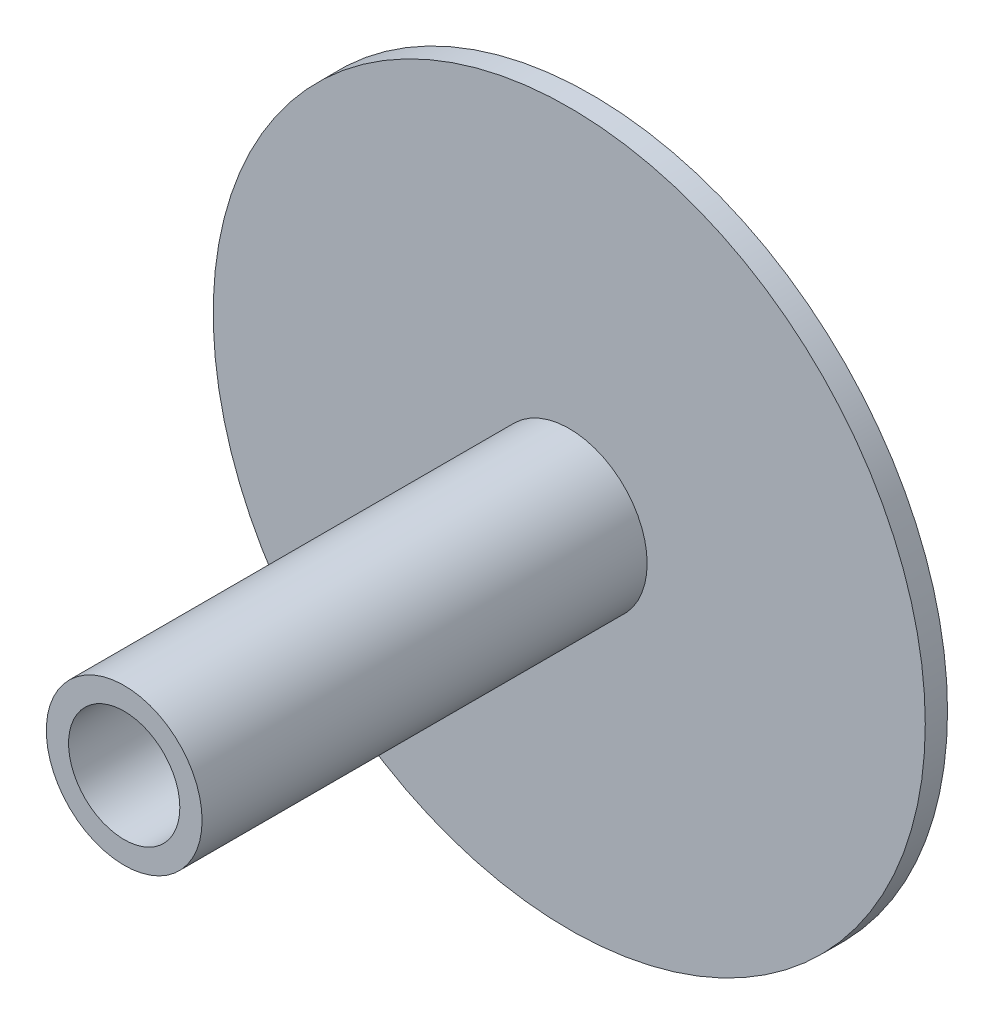
ISO-10303-21;
HEADER;
FILE_DESCRIPTION(('STEP AP214'),'2;1');
FILE_NAME('part.step','',(''),(''),'','','');
FILE_SCHEMA(('AUTOMOTIVE_DESIGN { 1 0 10303 214 1 1 1 1 }'));
ENDSEC;
DATA;
#1=APPLICATION_CONTEXT('core data for automotive mechanical design processes');
#2=APPLICATION_PROTOCOL_DEFINITION('international standard','automotive_design',2000,#1);
#3=PRODUCT_CONTEXT('',#1,'mechanical');
#4=PRODUCT('Part','Part','',(#3));
#5=PRODUCT_RELATED_PRODUCT_CATEGORY('part','',(#4));
#6=PRODUCT_DEFINITION_FORMATION('','',#4);
#7=PRODUCT_DEFINITION_CONTEXT('part definition',#1,'design');
#8=PRODUCT_DEFINITION('design','',#6,#7);
#9=PRODUCT_DEFINITION_SHAPE('','',#8);
#10=(LENGTH_UNIT() NAMED_UNIT(*) SI_UNIT(.MILLI.,.METRE.));
#11=(NAMED_UNIT(*) PLANE_ANGLE_UNIT() SI_UNIT($,.RADIAN.));
#12=(NAMED_UNIT(*) SI_UNIT($,.STERADIAN.) SOLID_ANGLE_UNIT());
#13=UNCERTAINTY_MEASURE_WITH_UNIT(LENGTH_MEASURE(1.E-05),#10,'distance_accuracy_value','');
#14=(GEOMETRIC_REPRESENTATION_CONTEXT(3) GLOBAL_UNCERTAINTY_ASSIGNED_CONTEXT((#13)) GLOBAL_UNIT_ASSIGNED_CONTEXT((#10,
#11,#12)) REPRESENTATION_CONTEXT('',''));
#15=CARTESIAN_POINT('',(0.,0.,0.));
#16=DIRECTION('',(0.,0.,1.));
#17=DIRECTION('',(1.,0.,0.));
#18=AXIS2_PLACEMENT_3D('',#15,#16,#17);
#19=CARTESIAN_POINT('',(0.,0.,1.));
#20=DIRECTION('',(0.,0.,-1.));
#21=DIRECTION('',(-1.,0.,0.));
#22=AXIS2_PLACEMENT_3D('',#19,#20,#21);
#23=CYLINDRICAL_SURFACE('',#22,16.);
#24=CARTESIAN_POINT('',(0.,0.,1.));
#25=DIRECTION('',(0.,0.,1.));
#26=DIRECTION('',(1.,0.,0.));
#27=AXIS2_PLACEMENT_3D('',#24,#25,#26);
#28=CIRCLE('',#27,16.);
#29=CARTESIAN_POINT('',(16.,0.,1.));
#30=VERTEX_POINT('',#29);
#31=EDGE_CURVE('E10',#30,#30,#28,.T.);
#32=ORIENTED_EDGE('',*,*,#31,.F.);
#33=EDGE_LOOP('',(#32));
#34=FACE_BOUND('',#33,.T.);
#35=CARTESIAN_POINT('',(0.,0.,0.));
#36=DIRECTION('',(0.,0.,1.));
#37=DIRECTION('',(1.,0.,0.));
#38=AXIS2_PLACEMENT_3D('',#35,#36,#37);
#39=CIRCLE('',#38,16.);
#40=CARTESIAN_POINT('',(16.,0.,0.));
#41=VERTEX_POINT('',#40);
#42=EDGE_CURVE('E38',#41,#41,#39,.T.);
#43=ORIENTED_EDGE('',*,*,#42,.T.);
#44=EDGE_LOOP('',(#43));
#45=FACE_BOUND('',#44,.T.);
#46=ADVANCED_FACE('F31',(#34,#45),#23,.T.);
#47=CARTESIAN_POINT('',(0.,0.,1.));
#48=DIRECTION('',(0.,0.,1.));
#49=DIRECTION('',(1.,0.,0.));
#50=AXIS2_PLACEMENT_3D('',#47,#48,#49);
#51=PLANE('',#50);
#52=CARTESIAN_POINT('',(0.,0.,1.));
#53=DIRECTION('',(0.,0.,1.));
#54=DIRECTION('',(1.,0.,0.));
#55=AXIS2_PLACEMENT_3D('',#52,#53,#54);
#56=CIRCLE('',#55,3.5);
#57=CARTESIAN_POINT('',(3.5,0.,1.));
#58=VERTEX_POINT('',#57);
#59=EDGE_CURVE('E45',#58,#58,#56,.T.);
#60=ORIENTED_EDGE('',*,*,#59,.F.);
#61=EDGE_LOOP('',(#60));
#62=FACE_BOUND('',#61,.T.);
#63=ORIENTED_EDGE('',*,*,#31,.T.);
#64=EDGE_LOOP('',(#63));
#65=FACE_BOUND('',#64,.T.);
#66=ADVANCED_FACE('F73',(#62,#65),#51,.T.);
#67=CARTESIAN_POINT('',(0.,0.,0.));
#68=DIRECTION('',(0.,0.,1.));
#69=DIRECTION('',(1.,0.,0.));
#70=AXIS2_PLACEMENT_3D('',#67,#68,#69);
#71=PLANE('',#70);
#72=CARTESIAN_POINT('',(0.,0.,0.));
#73=DIRECTION('',(0.,0.,1.));
#74=DIRECTION('',(1.,0.,0.));
#75=AXIS2_PLACEMENT_3D('',#72,#73,#74);
#76=CIRCLE('',#75,2.5);
#77=CARTESIAN_POINT('',(2.5,0.,0.));
#78=VERTEX_POINT('',#77);
#79=EDGE_CURVE('E50',#78,#78,#76,.T.);
#80=ORIENTED_EDGE('',*,*,#79,.T.);
#81=EDGE_LOOP('',(#80));
#82=FACE_BOUND('',#81,.T.);
#83=ORIENTED_EDGE('',*,*,#42,.F.);
#84=EDGE_LOOP('',(#83));
#85=FACE_BOUND('',#84,.T.);
#86=ADVANCED_FACE('F69',(#82,#85),#71,.F.);
#87=CARTESIAN_POINT('',(0.,0.,21.));
#88=DIRECTION('',(0.,0.,-1.));
#89=DIRECTION('',(-1.,0.,0.));
#90=AXIS2_PLACEMENT_3D('',#87,#88,#89);
#91=CYLINDRICAL_SURFACE('',#90,3.5);
#92=CARTESIAN_POINT('',(0.,0.,21.));
#93=DIRECTION('',(0.,0.,1.));
#94=DIRECTION('',(1.,0.,0.));
#95=AXIS2_PLACEMENT_3D('',#92,#93,#94);
#96=CIRCLE('',#95,3.5);
#97=CARTESIAN_POINT('',(3.5,0.,21.));
#98=VERTEX_POINT('',#97);
#99=EDGE_CURVE('E43',#98,#98,#96,.T.);
#100=ORIENTED_EDGE('',*,*,#99,.F.);
#101=EDGE_LOOP('',(#100));
#102=FACE_BOUND('',#101,.T.);
#103=ORIENTED_EDGE('',*,*,#59,.T.);
#104=EDGE_LOOP('',(#103));
#105=FACE_BOUND('',#104,.T.);
#106=ADVANCED_FACE('F63',(#102,#105),#91,.T.);
#107=CARTESIAN_POINT('',(0.,0.,21.));
#108=DIRECTION('',(0.,0.,1.));
#109=DIRECTION('',(1.,0.,0.));
#110=AXIS2_PLACEMENT_3D('',#107,#108,#109);
#111=PLANE('',#110);
#112=CARTESIAN_POINT('',(0.,0.,21.));
#113=DIRECTION('',(0.,0.,1.));
#114=DIRECTION('',(1.,0.,0.));
#115=AXIS2_PLACEMENT_3D('',#112,#113,#114);
#116=CIRCLE('',#115,2.5);
#117=CARTESIAN_POINT('',(2.5,0.,21.));
#118=VERTEX_POINT('',#117);
#119=EDGE_CURVE('E34',#118,#118,#116,.T.);
#120=ORIENTED_EDGE('',*,*,#119,.F.);
#121=EDGE_LOOP('',(#120));
#122=FACE_BOUND('',#121,.T.);
#123=ORIENTED_EDGE('',*,*,#99,.T.);
#124=EDGE_LOOP('',(#123));
#125=FACE_BOUND('',#124,.T.);
#126=ADVANCED_FACE('F60',(#122,#125),#111,.T.);
#127=CARTESIAN_POINT('',(0.,0.,0.));
#128=DIRECTION('',(0.,0.,1.));
#129=DIRECTION('',(1.,0.,0.));
#130=AXIS2_PLACEMENT_3D('',#127,#128,#129);
#131=CYLINDRICAL_SURFACE('',#130,2.5);
#132=CARTESIAN_POINT('',(2.5,0.,21.));
#133=CARTESIAN_POINT('',(2.5,0.,20.78125));
#134=CARTESIAN_POINT('',(2.5,0.,20.5625));
#135=CARTESIAN_POINT('',(2.5,0.,20.125));
#136=CARTESIAN_POINT('',(2.5,0.,19.90625));
#137=CARTESIAN_POINT('',(2.5,0.,19.46875));
#138=CARTESIAN_POINT('',(2.5,0.,19.25));
#139=CARTESIAN_POINT('',(2.5,0.,18.8125));
#140=CARTESIAN_POINT('',(2.5,0.,18.59375));
#141=CARTESIAN_POINT('',(2.5,0.,18.15625));
#142=CARTESIAN_POINT('',(2.5,0.,17.9375));
#143=CARTESIAN_POINT('',(2.5,0.,17.5));
#144=CARTESIAN_POINT('',(2.5,0.,17.28125));
#145=CARTESIAN_POINT('',(2.5,0.,16.84375));
#146=CARTESIAN_POINT('',(2.5,0.,16.625));
#147=CARTESIAN_POINT('',(2.5,0.,16.1875));
#148=CARTESIAN_POINT('',(2.5,0.,15.96875));
#149=CARTESIAN_POINT('',(2.5,0.,15.53125));
#150=CARTESIAN_POINT('',(2.5,0.,15.3125));
#151=CARTESIAN_POINT('',(2.5,0.,14.875));
#152=CARTESIAN_POINT('',(2.5,0.,14.65625));
#153=CARTESIAN_POINT('',(2.5,0.,14.21875));
#154=CARTESIAN_POINT('',(2.5,0.,14.));
#155=CARTESIAN_POINT('',(2.5,0.,13.5625));
#156=CARTESIAN_POINT('',(2.5,0.,13.34375));
#157=CARTESIAN_POINT('',(2.5,0.,12.90625));
#158=CARTESIAN_POINT('',(2.5,0.,12.6875));
#159=CARTESIAN_POINT('',(2.5,0.,12.25));
#160=CARTESIAN_POINT('',(2.5,0.,12.03125));
#161=CARTESIAN_POINT('',(2.5,0.,11.59375));
#162=CARTESIAN_POINT('',(2.5,0.,11.375));
#163=CARTESIAN_POINT('',(2.5,0.,10.9375));
#164=CARTESIAN_POINT('',(2.5,0.,10.71875));
#165=CARTESIAN_POINT('',(2.5,0.,10.28125));
#166=CARTESIAN_POINT('',(2.5,0.,10.0625));
#167=CARTESIAN_POINT('',(2.5,0.,9.625));
#168=CARTESIAN_POINT('',(2.5,0.,9.40625));
#169=CARTESIAN_POINT('',(2.5,0.,8.96875));
#170=CARTESIAN_POINT('',(2.5,0.,8.75));
#171=CARTESIAN_POINT('',(2.5,0.,8.3125));
#172=CARTESIAN_POINT('',(2.5,0.,8.09375));
#173=CARTESIAN_POINT('',(2.5,0.,7.65625));
#174=CARTESIAN_POINT('',(2.5,0.,7.4375));
#175=CARTESIAN_POINT('',(2.5,0.,7.));
#176=CARTESIAN_POINT('',(2.5,0.,6.78125));
#177=CARTESIAN_POINT('',(2.5,0.,6.34375));
#178=CARTESIAN_POINT('',(2.5,0.,6.125));
#179=CARTESIAN_POINT('',(2.5,0.,5.6875));
#180=CARTESIAN_POINT('',(2.5,0.,5.46875));
#181=CARTESIAN_POINT('',(2.5,0.,5.03125));
#182=CARTESIAN_POINT('',(2.5,0.,4.8125));
#183=CARTESIAN_POINT('',(2.5,0.,4.375));
#184=CARTESIAN_POINT('',(2.5,0.,4.15625));
#185=CARTESIAN_POINT('',(2.5,0.,3.71875));
#186=CARTESIAN_POINT('',(2.5,0.,3.5));
#187=CARTESIAN_POINT('',(2.5,0.,3.0625));
#188=CARTESIAN_POINT('',(2.5,0.,2.84375));
#189=CARTESIAN_POINT('',(2.5,0.,2.40625));
#190=CARTESIAN_POINT('',(2.5,0.,2.1875));
#191=CARTESIAN_POINT('',(2.5,0.,1.75));
#192=CARTESIAN_POINT('',(2.5,0.,1.53125));
#193=CARTESIAN_POINT('',(2.5,0.,1.09375));
#194=CARTESIAN_POINT('',(2.5,0.,0.875000000000001));
#195=CARTESIAN_POINT('',(2.5,0.,0.4375));
#196=CARTESIAN_POINT('',(2.5,0.,0.218750000000001));
#197=CARTESIAN_POINT('',(2.5,0.,0.));
#198=B_SPLINE_CURVE_WITH_KNOTS('',3,(#132,#133,#134,#135,#136,#137,#138,#139,#140,#141,#142,
#143,#144,#145,#146,#147,#148,#149,#150,#151,#152,#153,#154,#155,#156,#157,#158,#159,#160,#161,
#162,#163,#164,#165,#166,#167,#168,#169,#170,#171,#172,#173,#174,#175,#176,#177,#178,#179,#180,
#181,#182,#183,#184,#185,#186,#187,#188,#189,#190,#191,#192,#193,#194,#195,#196,#197),
.UNSPECIFIED.,.F.,.F.,(4,2,2,2,2,2,2,2,2,2,2,2,2,2,2,2,2,2,2,2,2,2,2,2,2,2,2,2,2,2,2,2,4),(0.,
0.656250000000001,1.3125,1.96875,2.625,3.28125,3.9375,4.59375,5.25,5.90625,6.5625,7.21875,7.875,
8.53125,9.1875,9.84375,10.5,11.15625,11.8125,12.46875,13.125,13.78125,14.4375,15.09375,15.75,
16.40625,17.0625,17.71875,18.375,19.03125,19.6875,20.34375,21.),.UNSPECIFIED.);
#199=EDGE_CURVE('BSEAM57',#118,#78,#198,.T.);
#200=ORIENTED_EDGE('',*,*,#119,.T.);
#201=ORIENTED_EDGE('',*,*,#79,.F.);
#202=ORIENTED_EDGE('',*,*,#199,.T.);
#203=ORIENTED_EDGE('',*,*,#199,.F.);
#204=EDGE_LOOP('',(#200,#202,#201,#203));
#205=FACE_BOUND('',#204,.T.);
#206=ADVANCED_FACE('F57',(#205),#131,.F.);
#207=CLOSED_SHELL('',(#46,#66,#86,#106,#126,#206));
#208=MANIFOLD_SOLID_BREP('B2',#207);
#209=ADVANCED_BREP_SHAPE_REPRESENTATION('',(#18,#208),#14);
#210=SHAPE_DEFINITION_REPRESENTATION(#9,#209);
ENDSEC;
END-ISO-10303-21;
